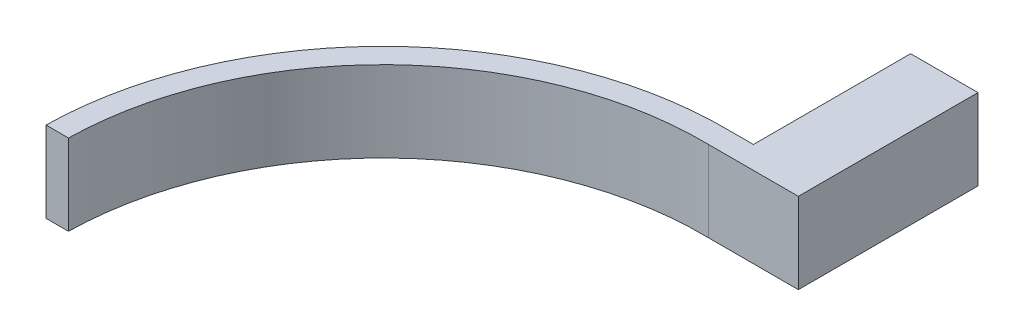
ISO-10303-21;
HEADER;
FILE_DESCRIPTION(('STEP AP214'),'2;1');
FILE_NAME('part.step','',(''),(''),'','','');
FILE_SCHEMA(('AUTOMOTIVE_DESIGN { 1 0 10303 214 1 1 1 1 }'));
ENDSEC;
DATA;
#1=APPLICATION_CONTEXT('core data for automotive mechanical design processes');
#2=APPLICATION_PROTOCOL_DEFINITION('international standard','automotive_design',2000,#1);
#3=PRODUCT_CONTEXT('',#1,'mechanical');
#4=PRODUCT('Part','Part','',(#3));
#5=PRODUCT_RELATED_PRODUCT_CATEGORY('part','',(#4));
#6=PRODUCT_DEFINITION_FORMATION('','',#4);
#7=PRODUCT_DEFINITION_CONTEXT('part definition',#1,'design');
#8=PRODUCT_DEFINITION('design','',#6,#7);
#9=PRODUCT_DEFINITION_SHAPE('','',#8);
#10=(LENGTH_UNIT() NAMED_UNIT(*) SI_UNIT(.MILLI.,.METRE.));
#11=(NAMED_UNIT(*) PLANE_ANGLE_UNIT() SI_UNIT($,.RADIAN.));
#12=(NAMED_UNIT(*) SI_UNIT($,.STERADIAN.) SOLID_ANGLE_UNIT());
#13=UNCERTAINTY_MEASURE_WITH_UNIT(LENGTH_MEASURE(1.E-05),#10,'distance_accuracy_value','');
#14=(GEOMETRIC_REPRESENTATION_CONTEXT(3) GLOBAL_UNCERTAINTY_ASSIGNED_CONTEXT((#13)) GLOBAL_UNIT_ASSIGNED_CONTEXT((#10,
#11,#12)) REPRESENTATION_CONTEXT('',''));
#15=CARTESIAN_POINT('',(0.,0.,0.));
#16=DIRECTION('',(0.,0.,1.));
#17=DIRECTION('',(1.,0.,0.));
#18=AXIS2_PLACEMENT_3D('',#15,#16,#17);
#19=CARTESIAN_POINT('',(57.5,18.,-30.));
#20=DIRECTION('',(-1.,0.,0.));
#21=DIRECTION('',(0.,0.,1.));
#22=AXIS2_PLACEMENT_3D('',#19,#20,#21);
#23=PLANE('',#22);
#24=DIRECTION('',(0.,0.,-1.));
#25=VECTOR('',#24,1.);
#26=CARTESIAN_POINT('',(57.5,0.,-30.));
#27=LINE('',#26,#25);
#28=CARTESIAN_POINT('',(57.5,0.,-30.));
#29=VERTEX_POINT('',#28);
#30=CARTESIAN_POINT('',(57.5,0.,-70.));
#31=VERTEX_POINT('',#30);
#32=EDGE_CURVE('E141',#29,#31,#27,.T.);
#33=ORIENTED_EDGE('',*,*,#32,.T.);
#34=DIRECTION('',(0.,-1.,0.));
#35=VECTOR('',#34,1.);
#36=CARTESIAN_POINT('',(57.5,18.,-70.));
#37=LINE('',#36,#35);
#38=CARTESIAN_POINT('',(57.5,18.,-70.));
#39=VERTEX_POINT('',#38);
#40=EDGE_CURVE('E11',#39,#31,#37,.T.);
#41=ORIENTED_EDGE('',*,*,#40,.F.);
#42=DIRECTION('',(0.,0.,-1.));
#43=VECTOR('',#42,1.);
#44=CARTESIAN_POINT('',(57.5,18.,-30.));
#45=LINE('',#44,#43);
#46=CARTESIAN_POINT('',(57.5,18.,-30.));
#47=VERTEX_POINT('',#46);
#48=EDGE_CURVE('E159',#47,#39,#45,.T.);
#49=ORIENTED_EDGE('',*,*,#48,.F.);
#50=DIRECTION('',(0.,-1.,0.));
#51=VECTOR('',#50,1.);
#52=CARTESIAN_POINT('',(57.5,18.,-30.));
#53=LINE('',#52,#51);
#54=EDGE_CURVE('E137',#47,#29,#53,.T.);
#55=ORIENTED_EDGE('',*,*,#54,.T.);
#56=EDGE_LOOP('',(#33,#41,#49,#55));
#57=FACE_BOUND('',#56,.T.);
#58=ADVANCED_FACE('F33',(#57),#23,.F.);
#59=CARTESIAN_POINT('',(57.5,18.,-70.));
#60=DIRECTION('',(0.,0.,1.));
#61=DIRECTION('',(1.,0.,0.));
#62=AXIS2_PLACEMENT_3D('',#59,#60,#61);
#63=PLANE('',#62);
#64=DIRECTION('',(1.,0.,0.));
#65=VECTOR('',#64,1.);
#66=CARTESIAN_POINT('',(50.,4.,-70.));
#67=LINE('',#66,#65);
#68=CARTESIAN_POINT('',(45.,4.,-70.));
#69=VERTEX_POINT('',#68);
#70=CARTESIAN_POINT('',(55.,4.,-70.));
#71=VERTEX_POINT('',#70);
#72=EDGE_CURVE('E206',#69,#71,#67,.T.);
#73=ORIENTED_EDGE('',*,*,#72,.F.);
#74=DIRECTION('',(0.,-1.,0.));
#75=VECTOR('',#74,1.);
#76=CARTESIAN_POINT('',(45.,4.,-70.));
#77=LINE('',#76,#75);
#78=CARTESIAN_POINT('',(45.,0.,-70.));
#79=VERTEX_POINT('',#78);
#80=EDGE_CURVE('E145',#69,#79,#77,.T.);
#81=ORIENTED_EDGE('',*,*,#80,.T.);
#82=DIRECTION('',(-1.,0.,0.));
#83=VECTOR('',#82,1.);
#84=CARTESIAN_POINT('',(57.5,0.,-70.));
#85=LINE('',#84,#83);
#86=CARTESIAN_POINT('',(42.5,0.,-70.));
#87=VERTEX_POINT('',#86);
#88=EDGE_CURVE('E144',#79,#87,#85,.T.);
#89=ORIENTED_EDGE('',*,*,#88,.T.);
#90=DIRECTION('',(0.,-1.,0.));
#91=VECTOR('',#90,1.);
#92=CARTESIAN_POINT('',(42.5,18.,-70.));
#93=LINE('',#92,#91);
#94=CARTESIAN_POINT('',(42.5,18.,-70.));
#95=VERTEX_POINT('',#94);
#96=EDGE_CURVE('E40',#95,#87,#93,.T.);
#97=ORIENTED_EDGE('',*,*,#96,.F.);
#98=DIRECTION('',(-1.,0.,0.));
#99=VECTOR('',#98,1.);
#100=CARTESIAN_POINT('',(57.5,18.,-70.));
#101=LINE('',#100,#99);
#102=EDGE_CURVE('E96',#39,#95,#101,.T.);
#103=ORIENTED_EDGE('',*,*,#102,.F.);
#104=ORIENTED_EDGE('',*,*,#40,.T.);
#105=CARTESIAN_POINT('',(55.,0.,-70.));
#106=VERTEX_POINT('',#105);
#107=EDGE_CURVE('E146',#31,#106,#85,.T.);
#108=ORIENTED_EDGE('',*,*,#107,.T.);
#109=DIRECTION('',(0.,-1.,0.));
#110=VECTOR('',#109,1.);
#111=CARTESIAN_POINT('',(55.,4.,-70.));
#112=LINE('',#111,#110);
#113=EDGE_CURVE('E47',#71,#106,#112,.T.);
#114=ORIENTED_EDGE('',*,*,#113,.F.);
#115=EDGE_LOOP('',(#73,#81,#89,#97,#103,#104,#108,#114));
#116=FACE_BOUND('',#115,.T.);
#117=ADVANCED_FACE('F228',(#116),#63,.F.);
#118=CARTESIAN_POINT('',(42.5,18.,-70.));
#119=DIRECTION('',(1.,0.,0.));
#120=DIRECTION('',(0.,0.,-1.));
#121=AXIS2_PLACEMENT_3D('',#118,#119,#120);
#122=PLANE('',#121);
#123=DIRECTION('',(0.,0.,1.));
#124=VECTOR('',#123,1.);
#125=CARTESIAN_POINT('',(42.5,0.,-70.));
#126=LINE('',#125,#124);
#127=CARTESIAN_POINT('',(42.5,0.,-35.));
#128=VERTEX_POINT('',#127);
#129=EDGE_CURVE('E149',#87,#128,#126,.T.);
#130=ORIENTED_EDGE('',*,*,#129,.T.);
#131=DIRECTION('',(0.,-1.,0.));
#132=VECTOR('',#131,1.);
#133=CARTESIAN_POINT('',(42.5,18.,-35.));
#134=LINE('',#133,#132);
#135=CARTESIAN_POINT('',(42.5,18.,-35.));
#136=VERTEX_POINT('',#135);
#137=EDGE_CURVE('E166',#136,#128,#134,.T.);
#138=ORIENTED_EDGE('',*,*,#137,.F.);
#139=DIRECTION('',(0.,0.,1.));
#140=VECTOR('',#139,1.);
#141=CARTESIAN_POINT('',(42.5,18.,-70.));
#142=LINE('',#141,#140);
#143=EDGE_CURVE('E174',#95,#136,#142,.T.);
#144=ORIENTED_EDGE('',*,*,#143,.F.);
#145=ORIENTED_EDGE('',*,*,#96,.T.);
#146=EDGE_LOOP('',(#130,#138,#144,#145));
#147=FACE_BOUND('',#146,.T.);
#148=ADVANCED_FACE('F172',(#147),#122,.F.);
#149=CARTESIAN_POINT('',(42.5,18.,-35.));
#150=DIRECTION('',(0.,0.,1.));
#151=DIRECTION('',(1.,0.,0.));
#152=AXIS2_PLACEMENT_3D('',#149,#150,#151);
#153=PLANE('',#152);
#154=DIRECTION('',(-1.,0.,0.));
#155=VECTOR('',#154,1.);
#156=CARTESIAN_POINT('',(42.5,0.,-35.));
#157=LINE('',#156,#155);
#158=CARTESIAN_POINT('',(37.5,0.,-35.));
#159=VERTEX_POINT('',#158);
#160=EDGE_CURVE('E151',#128,#159,#157,.T.);
#161=ORIENTED_EDGE('',*,*,#160,.T.);
#162=DIRECTION('',(0.,-1.,0.));
#163=VECTOR('',#162,1.);
#164=CARTESIAN_POINT('',(37.5,18.,-35.));
#165=LINE('',#164,#163);
#166=CARTESIAN_POINT('',(37.5,18.,-35.));
#167=VERTEX_POINT('',#166);
#168=EDGE_CURVE('E163',#167,#159,#165,.T.);
#169=ORIENTED_EDGE('',*,*,#168,.F.);
#170=DIRECTION('',(-1.,0.,0.));
#171=VECTOR('',#170,1.);
#172=CARTESIAN_POINT('',(42.5,18.,-35.));
#173=LINE('',#172,#171);
#174=EDGE_CURVE('E187',#136,#167,#173,.T.);
#175=ORIENTED_EDGE('',*,*,#174,.F.);
#176=ORIENTED_EDGE('',*,*,#137,.T.);
#177=EDGE_LOOP('',(#161,#169,#175,#176));
#178=FACE_BOUND('',#177,.T.);
#179=ADVANCED_FACE('F183',(#178),#153,.F.);
#180=CARTESIAN_POINT('',(36.25,18.,41.25));
#181=DIRECTION('',(0.,-1.,0.));
#182=DIRECTION('',(0.,0.,-1.));
#183=AXIS2_PLACEMENT_3D('',#180,#181,#182);
#184=CYLINDRICAL_SURFACE('',#183,76.2602452133483);
#185=CARTESIAN_POINT('',(36.25,0.,41.25));
#186=DIRECTION('',(0.,1.,0.));
#187=DIRECTION('',(0.,0.,-1.));
#188=AXIS2_PLACEMENT_3D('',#185,#186,#187);
#189=CIRCLE('',#188,76.2602452133483);
#190=CARTESIAN_POINT('',(-40.,0.,40.));
#191=VERTEX_POINT('',#190);
#192=EDGE_CURVE('E153',#159,#191,#189,.T.);
#193=ORIENTED_EDGE('',*,*,#192,.T.);
#194=DIRECTION('',(0.,-1.,0.));
#195=VECTOR('',#194,1.);
#196=CARTESIAN_POINT('',(-40.,18.,40.));
#197=LINE('',#196,#195);
#198=CARTESIAN_POINT('',(-40.,18.,40.));
#199=VERTEX_POINT('',#198);
#200=EDGE_CURVE('E132',#199,#191,#197,.T.);
#201=ORIENTED_EDGE('',*,*,#200,.F.);
#202=CARTESIAN_POINT('',(36.25,18.,41.25));
#203=DIRECTION('',(0.,1.,0.));
#204=DIRECTION('',(0.,0.,-1.));
#205=AXIS2_PLACEMENT_3D('',#202,#203,#204);
#206=CIRCLE('',#205,76.2602452133483);
#207=EDGE_CURVE('E119',#167,#199,#206,.T.);
#208=ORIENTED_EDGE('',*,*,#207,.F.);
#209=ORIENTED_EDGE('',*,*,#168,.T.);
#210=EDGE_LOOP('',(#193,#201,#208,#209));
#211=FACE_BOUND('',#210,.T.);
#212=ADVANCED_FACE('F186',(#211),#184,.T.);
#213=CARTESIAN_POINT('',(-35.,18.,40.));
#214=DIRECTION('',(0.,0.,-1.));
#215=DIRECTION('',(-1.,0.,0.));
#216=AXIS2_PLACEMENT_3D('',#213,#214,#215);
#217=PLANE('',#216);
#218=DIRECTION('',(1.,0.,0.));
#219=VECTOR('',#218,1.);
#220=CARTESIAN_POINT('',(-35.,0.,40.));
#221=LINE('',#220,#219);
#222=CARTESIAN_POINT('',(-35.,0.,40.));
#223=VERTEX_POINT('',#222);
#224=EDGE_CURVE('E128',#191,#223,#221,.T.);
#225=ORIENTED_EDGE('',*,*,#224,.T.);
#226=DIRECTION('',(0.,-1.,0.));
#227=VECTOR('',#226,1.);
#228=CARTESIAN_POINT('',(-35.,18.,40.));
#229=LINE('',#228,#227);
#230=CARTESIAN_POINT('',(-35.,18.,40.));
#231=VERTEX_POINT('',#230);
#232=EDGE_CURVE('E125',#231,#223,#229,.T.);
#233=ORIENTED_EDGE('',*,*,#232,.F.);
#234=DIRECTION('',(1.,0.,0.));
#235=VECTOR('',#234,1.);
#236=CARTESIAN_POINT('',(-35.,18.,40.));
#237=LINE('',#236,#235);
#238=EDGE_CURVE('E112',#199,#231,#237,.T.);
#239=ORIENTED_EDGE('',*,*,#238,.F.);
#240=ORIENTED_EDGE('',*,*,#200,.T.);
#241=EDGE_LOOP('',(#225,#233,#239,#240));
#242=FACE_BOUND('',#241,.T.);
#243=ADVANCED_FACE('F126',(#242),#217,.F.);
#244=CARTESIAN_POINT('',(36.2500000000001,18.,41.2500000000001));
#245=DIRECTION('',(0.,-1.,0.));
#246=DIRECTION('',(0.,0.,-1.));
#247=AXIS2_PLACEMENT_3D('',#244,#245,#246);
#248=CYLINDRICAL_SURFACE('',#247,71.2609640686963);
#249=CARTESIAN_POINT('',(36.2500000000001,0.,41.2500000000001));
#250=DIRECTION('',(0.,-1.,0.));
#251=DIRECTION('',(0.,0.,-1.));
#252=AXIS2_PLACEMENT_3D('',#249,#250,#251);
#253=CIRCLE('',#252,71.2609640686963);
#254=CARTESIAN_POINT('',(37.5,0.,-30.));
#255=VERTEX_POINT('',#254);
#256=EDGE_CURVE('E156',#223,#255,#253,.T.);
#257=ORIENTED_EDGE('',*,*,#256,.T.);
#258=DIRECTION('',(0.,-1.,0.));
#259=VECTOR('',#258,1.);
#260=CARTESIAN_POINT('',(37.5,18.,-30.));
#261=LINE('',#260,#259);
#262=CARTESIAN_POINT('',(37.5,18.,-30.));
#263=VERTEX_POINT('',#262);
#264=EDGE_CURVE('E133',#263,#255,#261,.T.);
#265=ORIENTED_EDGE('',*,*,#264,.F.);
#266=CARTESIAN_POINT('',(36.2500000000001,18.,41.2500000000001));
#267=DIRECTION('',(0.,-1.,0.));
#268=DIRECTION('',(0.,0.,-1.));
#269=AXIS2_PLACEMENT_3D('',#266,#267,#268);
#270=CIRCLE('',#269,71.2609640686963);
#271=EDGE_CURVE('E116',#231,#263,#270,.T.);
#272=ORIENTED_EDGE('',*,*,#271,.F.);
#273=ORIENTED_EDGE('',*,*,#232,.T.);
#274=EDGE_LOOP('',(#257,#265,#272,#273));
#275=FACE_BOUND('',#274,.T.);
#276=ADVANCED_FACE('F135',(#275),#248,.F.);
#277=CARTESIAN_POINT('',(47.5,18.,-30.));
#278=DIRECTION('',(0.,0.,-1.));
#279=DIRECTION('',(-1.,0.,0.));
#280=AXIS2_PLACEMENT_3D('',#277,#278,#279);
#281=PLANE('',#280);
#282=DIRECTION('',(1.,0.,0.));
#283=VECTOR('',#282,1.);
#284=CARTESIAN_POINT('',(47.5,0.,-30.));
#285=LINE('',#284,#283);
#286=EDGE_CURVE('E88',#255,#29,#285,.T.);
#287=ORIENTED_EDGE('',*,*,#286,.T.);
#288=ORIENTED_EDGE('',*,*,#54,.F.);
#289=DIRECTION('',(1.,0.,0.));
#290=VECTOR('',#289,1.);
#291=CARTESIAN_POINT('',(47.5,18.,-30.));
#292=LINE('',#291,#290);
#293=EDGE_CURVE('E56',#263,#47,#292,.T.);
#294=ORIENTED_EDGE('',*,*,#293,.F.);
#295=ORIENTED_EDGE('',*,*,#264,.T.);
#296=EDGE_LOOP('',(#287,#288,#294,#295));
#297=FACE_BOUND('',#296,.T.);
#298=ADVANCED_FACE('F263',(#297),#281,.F.);
#299=CARTESIAN_POINT('',(36.25,18.,41.25));
#300=DIRECTION('',(0.,-1.,0.));
#301=DIRECTION('',(0.,0.,-1.));
#302=AXIS2_PLACEMENT_3D('',#299,#300,#301);
#303=PLANE('',#302);
#304=ORIENTED_EDGE('',*,*,#48,.T.);
#305=ORIENTED_EDGE('',*,*,#102,.T.);
#306=ORIENTED_EDGE('',*,*,#143,.T.);
#307=ORIENTED_EDGE('',*,*,#174,.T.);
#308=ORIENTED_EDGE('',*,*,#207,.T.);
#309=ORIENTED_EDGE('',*,*,#238,.T.);
#310=ORIENTED_EDGE('',*,*,#271,.T.);
#311=ORIENTED_EDGE('',*,*,#293,.T.);
#312=EDGE_LOOP('',(#304,#305,#306,#307,#308,#309,#310,#311));
#313=FACE_BOUND('',#312,.T.);
#314=ADVANCED_FACE('F114',(#313),#303,.F.);
#315=CARTESIAN_POINT('',(36.25,0.,41.25));
#316=DIRECTION('',(0.,-1.,0.));
#317=DIRECTION('',(0.,0.,-1.));
#318=AXIS2_PLACEMENT_3D('',#315,#316,#317);
#319=PLANE('',#318);
#320=DIRECTION('',(0.,0.,-1.));
#321=VECTOR('',#320,1.);
#322=CARTESIAN_POINT('',(45.,0.,-70.));
#323=LINE('',#322,#321);
#324=CARTESIAN_POINT('',(45.,0.,-40.));
#325=VERTEX_POINT('',#324);
#326=EDGE_CURVE('E203',#325,#79,#323,.T.);
#327=ORIENTED_EDGE('',*,*,#326,.F.);
#328=DIRECTION('',(-1.,0.,0.));
#329=VECTOR('',#328,1.);
#330=CARTESIAN_POINT('',(45.,0.,-40.));
#331=LINE('',#330,#329);
#332=CARTESIAN_POINT('',(55.,0.,-40.));
#333=VERTEX_POINT('',#332);
#334=EDGE_CURVE('E207',#333,#325,#331,.T.);
#335=ORIENTED_EDGE('',*,*,#334,.F.);
#336=DIRECTION('',(0.,0.,1.));
#337=VECTOR('',#336,1.);
#338=CARTESIAN_POINT('',(55.,0.,-40.));
#339=LINE('',#338,#337);
#340=EDGE_CURVE('E210',#106,#333,#339,.T.);
#341=ORIENTED_EDGE('',*,*,#340,.F.);
#342=ORIENTED_EDGE('',*,*,#107,.F.);
#343=ORIENTED_EDGE('',*,*,#32,.F.);
#344=ORIENTED_EDGE('',*,*,#286,.F.);
#345=ORIENTED_EDGE('',*,*,#256,.F.);
#346=ORIENTED_EDGE('',*,*,#224,.F.);
#347=ORIENTED_EDGE('',*,*,#192,.F.);
#348=ORIENTED_EDGE('',*,*,#160,.F.);
#349=ORIENTED_EDGE('',*,*,#129,.F.);
#350=ORIENTED_EDGE('',*,*,#88,.F.);
#351=EDGE_LOOP('',(#327,#335,#341,#342,#343,#344,#345,#346,#347,#348,#349,#350));
#352=FACE_BOUND('',#351,.T.);
#353=ADVANCED_FACE('F179',(#352),#319,.T.);
#354=CARTESIAN_POINT('',(45.,4.,-70.));
#355=DIRECTION('',(-1.,0.,0.));
#356=DIRECTION('',(0.,0.,1.));
#357=AXIS2_PLACEMENT_3D('',#354,#355,#356);
#358=PLANE('',#357);
#359=ORIENTED_EDGE('',*,*,#326,.T.);
#360=ORIENTED_EDGE('',*,*,#80,.F.);
#361=DIRECTION('',(0.,0.,-1.));
#362=VECTOR('',#361,1.);
#363=CARTESIAN_POINT('',(45.,4.,-70.));
#364=LINE('',#363,#362);
#365=CARTESIAN_POINT('',(45.,4.,-40.));
#366=VERTEX_POINT('',#365);
#367=EDGE_CURVE('E195',#366,#69,#364,.T.);
#368=ORIENTED_EDGE('',*,*,#367,.F.);
#369=DIRECTION('',(0.,-1.,0.));
#370=VECTOR('',#369,1.);
#371=CARTESIAN_POINT('',(45.,4.,-40.));
#372=LINE('',#371,#370);
#373=EDGE_CURVE('E198',#366,#325,#372,.T.);
#374=ORIENTED_EDGE('',*,*,#373,.T.);
#375=EDGE_LOOP('',(#359,#360,#368,#374));
#376=FACE_BOUND('',#375,.T.);
#377=ADVANCED_FACE('F247',(#376),#358,.F.);
#378=CARTESIAN_POINT('',(45.,4.,-40.));
#379=DIRECTION('',(0.,0.,1.));
#380=DIRECTION('',(1.,0.,0.));
#381=AXIS2_PLACEMENT_3D('',#378,#379,#380);
#382=PLANE('',#381);
#383=ORIENTED_EDGE('',*,*,#334,.T.);
#384=ORIENTED_EDGE('',*,*,#373,.F.);
#385=DIRECTION('',(-1.,0.,0.));
#386=VECTOR('',#385,1.);
#387=CARTESIAN_POINT('',(45.,4.,-40.));
#388=LINE('',#387,#386);
#389=CARTESIAN_POINT('',(55.,4.,-40.));
#390=VERTEX_POINT('',#389);
#391=EDGE_CURVE('E214',#390,#366,#388,.T.);
#392=ORIENTED_EDGE('',*,*,#391,.F.);
#393=DIRECTION('',(0.,-1.,0.));
#394=VECTOR('',#393,1.);
#395=CARTESIAN_POINT('',(55.,4.,-40.));
#396=LINE('',#395,#394);
#397=EDGE_CURVE('E194',#390,#333,#396,.T.);
#398=ORIENTED_EDGE('',*,*,#397,.T.);
#399=EDGE_LOOP('',(#383,#384,#392,#398));
#400=FACE_BOUND('',#399,.T.);
#401=ADVANCED_FACE('F245',(#400),#382,.F.);
#402=CARTESIAN_POINT('',(55.,4.,-40.));
#403=DIRECTION('',(1.,0.,0.));
#404=DIRECTION('',(0.,0.,-1.));
#405=AXIS2_PLACEMENT_3D('',#402,#403,#404);
#406=PLANE('',#405);
#407=ORIENTED_EDGE('',*,*,#340,.T.);
#408=ORIENTED_EDGE('',*,*,#397,.F.);
#409=DIRECTION('',(0.,0.,1.));
#410=VECTOR('',#409,1.);
#411=CARTESIAN_POINT('',(55.,4.,-40.));
#412=LINE('',#411,#410);
#413=EDGE_CURVE('E217',#71,#390,#412,.T.);
#414=ORIENTED_EDGE('',*,*,#413,.F.);
#415=ORIENTED_EDGE('',*,*,#113,.T.);
#416=EDGE_LOOP('',(#407,#408,#414,#415));
#417=FACE_BOUND('',#416,.T.);
#418=ADVANCED_FACE('F234',(#417),#406,.F.);
#419=CARTESIAN_POINT('',(0.,4.,0.));
#420=DIRECTION('',(0.,1.,0.));
#421=DIRECTION('',(0.,0.,1.));
#422=AXIS2_PLACEMENT_3D('',#419,#420,#421);
#423=PLANE('',#422);
#424=ORIENTED_EDGE('',*,*,#72,.T.);
#425=ORIENTED_EDGE('',*,*,#413,.T.);
#426=ORIENTED_EDGE('',*,*,#391,.T.);
#427=ORIENTED_EDGE('',*,*,#367,.T.);
#428=EDGE_LOOP('',(#424,#425,#426,#427));
#429=FACE_BOUND('',#428,.T.);
#430=ADVANCED_FACE('F224',(#429),#423,.F.);
#431=CLOSED_SHELL('',(#58,#117,#148,#179,#212,#243,#276,#298,#314,#353,#377,#401,#418,#430));
#432=MANIFOLD_SOLID_BREP('B2',#431);
#433=ADVANCED_BREP_SHAPE_REPRESENTATION('',(#18,#432),#14);
#434=SHAPE_DEFINITION_REPRESENTATION(#9,#433);
ENDSEC;
END-ISO-10303-21;
